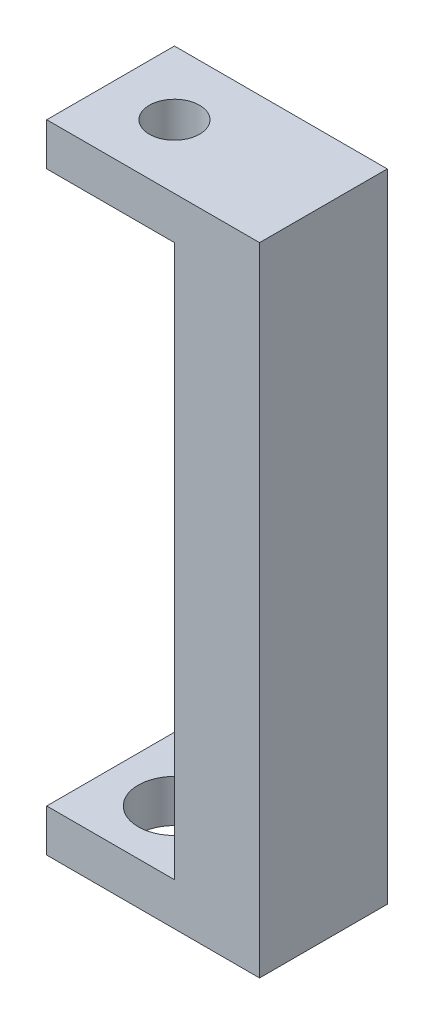
ISO-10303-21;
HEADER;
FILE_DESCRIPTION(('STEP AP214'),'2;1');
FILE_NAME('part.step','',(''),(''),'','','');
FILE_SCHEMA(('AUTOMOTIVE_DESIGN { 1 0 10303 214 1 1 1 1 }'));
ENDSEC;
DATA;
#1=APPLICATION_CONTEXT('core data for automotive mechanical design processes');
#2=APPLICATION_PROTOCOL_DEFINITION('international standard','automotive_design',2000,#1);
#3=PRODUCT_CONTEXT('',#1,'mechanical');
#4=PRODUCT('Part','Part','',(#3));
#5=PRODUCT_RELATED_PRODUCT_CATEGORY('part','',(#4));
#6=PRODUCT_DEFINITION_FORMATION('','',#4);
#7=PRODUCT_DEFINITION_CONTEXT('part definition',#1,'design');
#8=PRODUCT_DEFINITION('design','',#6,#7);
#9=PRODUCT_DEFINITION_SHAPE('','',#8);
#10=(LENGTH_UNIT() NAMED_UNIT(*) SI_UNIT(.MILLI.,.METRE.));
#11=(NAMED_UNIT(*) PLANE_ANGLE_UNIT() SI_UNIT($,.RADIAN.));
#12=(NAMED_UNIT(*) SI_UNIT($,.STERADIAN.) SOLID_ANGLE_UNIT());
#13=UNCERTAINTY_MEASURE_WITH_UNIT(LENGTH_MEASURE(1.E-05),#10,'distance_accuracy_value','');
#14=(GEOMETRIC_REPRESENTATION_CONTEXT(3) GLOBAL_UNCERTAINTY_ASSIGNED_CONTEXT((#13)) GLOBAL_UNIT_ASSIGNED_CONTEXT((#10,
#11,#12)) REPRESENTATION_CONTEXT('',''));
#15=CARTESIAN_POINT('',(0.,0.,0.));
#16=DIRECTION('',(0.,0.,1.));
#17=DIRECTION('',(1.,0.,0.));
#18=AXIS2_PLACEMENT_3D('',#15,#16,#17);
#19=CARTESIAN_POINT('',(-8.74763523506,18.4164001295598,7.62));
#20=DIRECTION('',(1.,0.,0.));
#21=DIRECTION('',(0.,0.,-1.));
#22=AXIS2_PLACEMENT_3D('',#19,#20,#21);
#23=PLANE('',#22);
#24=DIRECTION('',(0.,-1.,0.));
#25=VECTOR('',#24,1.);
#26=CARTESIAN_POINT('',(-8.74763523506,18.4164001295598,0.));
#27=LINE('',#26,#25);
#28=CARTESIAN_POINT('',(-8.74763523506,18.4164001295598,0.));
#29=VERTEX_POINT('',#28);
#30=CARTESIAN_POINT('',(-8.74763523506,15.8764001295598,0.));
#31=VERTEX_POINT('',#30);
#32=EDGE_CURVE('E128',#29,#31,#27,.T.);
#33=ORIENTED_EDGE('',*,*,#32,.T.);
#34=DIRECTION('',(0.,0.,-1.));
#35=VECTOR('',#34,1.);
#36=CARTESIAN_POINT('',(-8.74763523506,15.8764001295598,7.62));
#37=LINE('',#36,#35);
#38=CARTESIAN_POINT('',(-8.74763523506,15.8764001295598,7.62));
#39=VERTEX_POINT('',#38);
#40=EDGE_CURVE('E11',#39,#31,#37,.T.);
#41=ORIENTED_EDGE('',*,*,#40,.F.);
#42=DIRECTION('',(0.,-1.,0.));
#43=VECTOR('',#42,1.);
#44=CARTESIAN_POINT('',(-8.74763523506,18.4164001295598,7.62));
#45=LINE('',#44,#43);
#46=CARTESIAN_POINT('',(-8.74763523506,18.4164001295598,7.62));
#47=VERTEX_POINT('',#46);
#48=EDGE_CURVE('E143',#47,#39,#45,.T.);
#49=ORIENTED_EDGE('',*,*,#48,.F.);
#50=DIRECTION('',(0.,0.,-1.));
#51=VECTOR('',#50,1.);
#52=CARTESIAN_POINT('',(-8.74763523506,18.4164001295598,7.62));
#53=LINE('',#52,#51);
#54=EDGE_CURVE('E124',#47,#29,#53,.T.);
#55=ORIENTED_EDGE('',*,*,#54,.T.);
#56=EDGE_LOOP('',(#33,#41,#49,#55));
#57=FACE_BOUND('',#56,.T.);
#58=ADVANCED_FACE('F32',(#57),#23,.F.);
#59=CARTESIAN_POINT('',(-8.74763523506,15.8764001295598,7.62));
#60=DIRECTION('',(0.,1.,0.));
#61=DIRECTION('',(0.,0.,1.));
#62=AXIS2_PLACEMENT_3D('',#59,#60,#61);
#63=PLANE('',#62);
#64=CARTESIAN_POINT('',(-4.93763523506,15.8764001295598,3.81));
#65=DIRECTION('',(0.,-1.,0.));
#66=DIRECTION('',(0.,0.,-1.));
#67=AXIS2_PLACEMENT_3D('',#64,#65,#66);
#68=CIRCLE('',#67,1.5);
#69=CARTESIAN_POINT('',(-4.93763523506,15.8764001295598,2.31));
#70=VERTEX_POINT('',#69);
#71=EDGE_CURVE('E182',#70,#70,#68,.T.);
#72=ORIENTED_EDGE('',*,*,#71,.F.);
#73=EDGE_LOOP('',(#72));
#74=FACE_BOUND('',#73,.T.);
#75=DIRECTION('',(1.,0.,0.));
#76=VECTOR('',#75,1.);
#77=CARTESIAN_POINT('',(-8.74763523506,15.8764001295598,0.));
#78=LINE('',#77,#76);
#79=CARTESIAN_POINT('',(-1.12763523506,15.8764001295598,0.));
#80=VERTEX_POINT('',#79);
#81=EDGE_CURVE('E131',#31,#80,#78,.T.);
#82=ORIENTED_EDGE('',*,*,#81,.T.);
#83=DIRECTION('',(0.,0.,-1.));
#84=VECTOR('',#83,1.);
#85=CARTESIAN_POINT('',(-1.12763523506,15.8764001295598,7.62));
#86=LINE('',#85,#84);
#87=CARTESIAN_POINT('',(-1.12763523506,15.8764001295598,7.62));
#88=VERTEX_POINT('',#87);
#89=EDGE_CURVE('E40',#88,#80,#86,.T.);
#90=ORIENTED_EDGE('',*,*,#89,.F.);
#91=DIRECTION('',(1.,0.,0.));
#92=VECTOR('',#91,1.);
#93=CARTESIAN_POINT('',(-8.74763523506,15.8764001295598,7.62));
#94=LINE('',#93,#92);
#95=EDGE_CURVE('E91',#39,#88,#94,.T.);
#96=ORIENTED_EDGE('',*,*,#95,.F.);
#97=ORIENTED_EDGE('',*,*,#40,.T.);
#98=EDGE_LOOP('',(#82,#90,#96,#97));
#99=FACE_BOUND('',#98,.T.);
#100=ADVANCED_FACE('F197',(#74,#99),#63,.F.);
#101=CARTESIAN_POINT('',(-1.12763523506,15.8764001295598,7.62));
#102=DIRECTION('',(1.,0.,0.));
#103=DIRECTION('',(0.,1.,0.));
#104=AXIS2_PLACEMENT_3D('',#101,#102,#103);
#105=PLANE('',#104);
#106=DIRECTION('',(0.,-1.,0.));
#107=VECTOR('',#106,1.);
#108=CARTESIAN_POINT('',(-1.12763523506,15.8764001295598,0.));
#109=LINE('',#108,#107);
#110=CARTESIAN_POINT('',(-1.12763523506,-17.0435998704402,0.));
#111=VERTEX_POINT('',#110);
#112=EDGE_CURVE('E134',#80,#111,#109,.T.);
#113=ORIENTED_EDGE('',*,*,#112,.T.);
#114=DIRECTION('',(0.,0.,-1.));
#115=VECTOR('',#114,1.);
#116=CARTESIAN_POINT('',(-1.12763523506,-17.0435998704402,7.62));
#117=LINE('',#116,#115);
#118=CARTESIAN_POINT('',(-1.12763523506,-17.0435998704402,7.62));
#119=VERTEX_POINT('',#118);
#120=EDGE_CURVE('E150',#119,#111,#117,.T.);
#121=ORIENTED_EDGE('',*,*,#120,.F.);
#122=DIRECTION('',(0.,-1.,0.));
#123=VECTOR('',#122,1.);
#124=CARTESIAN_POINT('',(-1.12763523506,15.8764001295598,7.62));
#125=LINE('',#124,#123);
#126=EDGE_CURVE('E158',#88,#119,#125,.T.);
#127=ORIENTED_EDGE('',*,*,#126,.F.);
#128=ORIENTED_EDGE('',*,*,#89,.T.);
#129=EDGE_LOOP('',(#113,#121,#127,#128));
#130=FACE_BOUND('',#129,.T.);
#131=ADVANCED_FACE('F156',(#130),#105,.F.);
#132=CARTESIAN_POINT('',(-8.74763523506,-17.0435998704402,7.62));
#133=DIRECTION('',(0.,-1.,0.));
#134=DIRECTION('',(0.,0.,-1.));
#135=AXIS2_PLACEMENT_3D('',#132,#133,#134);
#136=PLANE('',#135);
#137=CARTESIAN_POINT('',(-4.93763523506,-17.0435998704402,3.81));
#138=DIRECTION('',(0.,1.,0.));
#139=DIRECTION('',(0.,0.,1.));
#140=AXIS2_PLACEMENT_3D('',#137,#138,#139);
#141=CIRCLE('',#140,2.159);
#142=CARTESIAN_POINT('',(-4.93763523506,-17.0435998704402,5.969));
#143=VERTEX_POINT('',#142);
#144=EDGE_CURVE('E176',#143,#143,#141,.T.);
#145=ORIENTED_EDGE('',*,*,#144,.F.);
#146=EDGE_LOOP('',(#145));
#147=FACE_BOUND('',#146,.T.);
#148=DIRECTION('',(-1.,0.,0.));
#149=VECTOR('',#148,1.);
#150=CARTESIAN_POINT('',(-8.74763523506,-17.0435998704402,0.));
#151=LINE('',#150,#149);
#152=CARTESIAN_POINT('',(-8.74763523506,-17.0435998704402,0.));
#153=VERTEX_POINT('',#152);
#154=EDGE_CURVE('E136',#111,#153,#151,.T.);
#155=ORIENTED_EDGE('',*,*,#154,.T.);
#156=DIRECTION('',(0.,0.,-1.));
#157=VECTOR('',#156,1.);
#158=CARTESIAN_POINT('',(-8.74763523506,-17.0435998704402,7.62));
#159=LINE('',#158,#157);
#160=CARTESIAN_POINT('',(-8.74763523506,-17.0435998704402,7.62));
#161=VERTEX_POINT('',#160);
#162=EDGE_CURVE('E147',#161,#153,#159,.T.);
#163=ORIENTED_EDGE('',*,*,#162,.F.);
#164=DIRECTION('',(-1.,0.,0.));
#165=VECTOR('',#164,1.);
#166=CARTESIAN_POINT('',(-8.74763523506,-17.0435998704402,7.62));
#167=LINE('',#166,#165);
#168=EDGE_CURVE('E170',#119,#161,#167,.T.);
#169=ORIENTED_EDGE('',*,*,#168,.F.);
#170=ORIENTED_EDGE('',*,*,#120,.T.);
#171=EDGE_LOOP('',(#155,#163,#169,#170));
#172=FACE_BOUND('',#171,.T.);
#173=ADVANCED_FACE('F166',(#147,#172),#136,.F.);
#174=CARTESIAN_POINT('',(-8.74763523506,-17.0435998704402,7.62));
#175=DIRECTION('',(1.,0.,0.));
#176=DIRECTION('',(0.,0.,-1.));
#177=AXIS2_PLACEMENT_3D('',#174,#175,#176);
#178=PLANE('',#177);
#179=DIRECTION('',(0.,-1.,0.));
#180=VECTOR('',#179,1.);
#181=CARTESIAN_POINT('',(-8.74763523506,-17.0435998704402,0.));
#182=LINE('',#181,#180);
#183=CARTESIAN_POINT('',(-8.74763523506,-19.5835998704402,0.));
#184=VERTEX_POINT('',#183);
#185=EDGE_CURVE('E138',#153,#184,#182,.T.);
#186=ORIENTED_EDGE('',*,*,#185,.T.);
#187=DIRECTION('',(0.,0.,-1.));
#188=VECTOR('',#187,1.);
#189=CARTESIAN_POINT('',(-8.74763523506,-19.5835998704402,7.62));
#190=LINE('',#189,#188);
#191=CARTESIAN_POINT('',(-8.74763523506,-19.5835998704402,7.62));
#192=VERTEX_POINT('',#191);
#193=EDGE_CURVE('E119',#192,#184,#190,.T.);
#194=ORIENTED_EDGE('',*,*,#193,.F.);
#195=DIRECTION('',(0.,-1.,0.));
#196=VECTOR('',#195,1.);
#197=CARTESIAN_POINT('',(-8.74763523506,-17.0435998704402,7.62));
#198=LINE('',#197,#196);
#199=EDGE_CURVE('E110',#161,#192,#198,.T.);
#200=ORIENTED_EDGE('',*,*,#199,.F.);
#201=ORIENTED_EDGE('',*,*,#162,.T.);
#202=EDGE_LOOP('',(#186,#194,#200,#201));
#203=FACE_BOUND('',#202,.T.);
#204=ADVANCED_FACE('F169',(#203),#178,.F.);
#205=CARTESIAN_POINT('',(-8.74763523506,-19.5835998704402,7.62));
#206=DIRECTION('',(0.,1.,0.));
#207=DIRECTION('',(0.,0.,1.));
#208=AXIS2_PLACEMENT_3D('',#205,#206,#207);
#209=PLANE('',#208);
#210=CARTESIAN_POINT('',(-4.93763523506,-19.5835998704402,3.81));
#211=DIRECTION('',(0.,1.,0.));
#212=DIRECTION('',(0.,0.,1.));
#213=AXIS2_PLACEMENT_3D('',#210,#211,#212);
#214=CIRCLE('',#213,2.159);
#215=CARTESIAN_POINT('',(-4.93763523506,-19.5835998704402,5.969));
#216=VERTEX_POINT('',#215);
#217=EDGE_CURVE('E132',#216,#216,#214,.T.);
#218=ORIENTED_EDGE('',*,*,#217,.T.);
#219=EDGE_LOOP('',(#218));
#220=FACE_BOUND('',#219,.T.);
#221=DIRECTION('',(1.,0.,0.));
#222=VECTOR('',#221,1.);
#223=CARTESIAN_POINT('',(-8.74763523506,-19.5835998704402,0.));
#224=LINE('',#223,#222);
#225=CARTESIAN_POINT('',(3.95236476494,-19.5835998704402,0.));
#226=VERTEX_POINT('',#225);
#227=EDGE_CURVE('E118',#184,#226,#224,.T.);
#228=ORIENTED_EDGE('',*,*,#227,.T.);
#229=DIRECTION('',(0.,0.,-1.));
#230=VECTOR('',#229,1.);
#231=CARTESIAN_POINT('',(3.95236476494,-19.5835998704402,7.62));
#232=LINE('',#231,#230);
#233=CARTESIAN_POINT('',(3.95236476494,-19.5835998704402,7.62));
#234=VERTEX_POINT('',#233);
#235=EDGE_CURVE('E115',#234,#226,#232,.T.);
#236=ORIENTED_EDGE('',*,*,#235,.F.);
#237=DIRECTION('',(1.,0.,0.));
#238=VECTOR('',#237,1.);
#239=CARTESIAN_POINT('',(-8.74763523506,-19.5835998704402,7.62));
#240=LINE('',#239,#238);
#241=EDGE_CURVE('E104',#192,#234,#240,.T.);
#242=ORIENTED_EDGE('',*,*,#241,.F.);
#243=ORIENTED_EDGE('',*,*,#193,.T.);
#244=EDGE_LOOP('',(#228,#236,#242,#243));
#245=FACE_BOUND('',#244,.T.);
#246=ADVANCED_FACE('F116',(#220,#245),#209,.F.);
#247=CARTESIAN_POINT('',(3.95236476494,18.4164001295598,7.62));
#248=DIRECTION('',(-1.,0.,0.));
#249=DIRECTION('',(0.,-1.,0.));
#250=AXIS2_PLACEMENT_3D('',#247,#248,#249);
#251=PLANE('',#250);
#252=DIRECTION('',(0.,1.,0.));
#253=VECTOR('',#252,1.);
#254=CARTESIAN_POINT('',(3.95236476494,18.4164001295598,0.));
#255=LINE('',#254,#253);
#256=CARTESIAN_POINT('',(3.95236476494,18.4164001295598,0.));
#257=VERTEX_POINT('',#256);
#258=EDGE_CURVE('E77',#226,#257,#255,.T.);
#259=ORIENTED_EDGE('',*,*,#258,.T.);
#260=DIRECTION('',(0.,0.,-1.));
#261=VECTOR('',#260,1.);
#262=CARTESIAN_POINT('',(3.95236476494,18.4164001295598,7.62));
#263=LINE('',#262,#261);
#264=CARTESIAN_POINT('',(3.95236476494,18.4164001295598,7.62));
#265=VERTEX_POINT('',#264);
#266=EDGE_CURVE('E120',#265,#257,#263,.T.);
#267=ORIENTED_EDGE('',*,*,#266,.F.);
#268=DIRECTION('',(0.,1.,0.));
#269=VECTOR('',#268,1.);
#270=CARTESIAN_POINT('',(3.95236476494,18.4164001295598,7.62));
#271=LINE('',#270,#269);
#272=EDGE_CURVE('E108',#234,#265,#271,.T.);
#273=ORIENTED_EDGE('',*,*,#272,.F.);
#274=ORIENTED_EDGE('',*,*,#235,.T.);
#275=EDGE_LOOP('',(#259,#267,#273,#274));
#276=FACE_BOUND('',#275,.T.);
#277=ADVANCED_FACE('F122',(#276),#251,.F.);
#278=CARTESIAN_POINT('',(-8.74763523506,18.4164001295598,7.62));
#279=DIRECTION('',(0.,-1.,0.));
#280=DIRECTION('',(0.,0.,-1.));
#281=AXIS2_PLACEMENT_3D('',#278,#279,#280);
#282=PLANE('',#281);
#283=CARTESIAN_POINT('',(-4.93763523506,18.4164001295598,3.81));
#284=DIRECTION('',(0.,-1.,0.));
#285=DIRECTION('',(0.,0.,-1.));
#286=AXIS2_PLACEMENT_3D('',#283,#284,#285);
#287=CIRCLE('',#286,1.5);
#288=CARTESIAN_POINT('',(-4.93763523506,18.4164001295598,2.31));
#289=VERTEX_POINT('',#288);
#290=EDGE_CURVE('E179',#289,#289,#287,.T.);
#291=ORIENTED_EDGE('',*,*,#290,.T.);
#292=EDGE_LOOP('',(#291));
#293=FACE_BOUND('',#292,.T.);
#294=DIRECTION('',(-1.,0.,0.));
#295=VECTOR('',#294,1.);
#296=CARTESIAN_POINT('',(-8.74763523506,18.4164001295598,0.));
#297=LINE('',#296,#295);
#298=EDGE_CURVE('E83',#257,#29,#297,.T.);
#299=ORIENTED_EDGE('',*,*,#298,.T.);
#300=ORIENTED_EDGE('',*,*,#54,.F.);
#301=DIRECTION('',(-1.,0.,0.));
#302=VECTOR('',#301,1.);
#303=CARTESIAN_POINT('',(-8.74763523506,18.4164001295598,7.62));
#304=LINE('',#303,#302);
#305=EDGE_CURVE('E48',#265,#47,#304,.T.);
#306=ORIENTED_EDGE('',*,*,#305,.F.);
#307=ORIENTED_EDGE('',*,*,#266,.T.);
#308=EDGE_LOOP('',(#299,#300,#306,#307));
#309=FACE_BOUND('',#308,.T.);
#310=ADVANCED_FACE('F188',(#293,#309),#282,.F.);
#311=CARTESIAN_POINT('',(0.,0.,7.62));
#312=DIRECTION('',(0.,0.,1.));
#313=DIRECTION('',(1.,0.,0.));
#314=AXIS2_PLACEMENT_3D('',#311,#312,#313);
#315=PLANE('',#314);
#316=ORIENTED_EDGE('',*,*,#48,.T.);
#317=ORIENTED_EDGE('',*,*,#95,.T.);
#318=ORIENTED_EDGE('',*,*,#126,.T.);
#319=ORIENTED_EDGE('',*,*,#168,.T.);
#320=ORIENTED_EDGE('',*,*,#199,.T.);
#321=ORIENTED_EDGE('',*,*,#241,.T.);
#322=ORIENTED_EDGE('',*,*,#272,.T.);
#323=ORIENTED_EDGE('',*,*,#305,.T.);
#324=EDGE_LOOP('',(#316,#317,#318,#319,#320,#321,#322,#323));
#325=FACE_BOUND('',#324,.T.);
#326=ADVANCED_FACE('F106',(#325),#315,.T.);
#327=CARTESIAN_POINT('',(0.,0.,0.));
#328=DIRECTION('',(0.,0.,1.));
#329=DIRECTION('',(1.,0.,0.));
#330=AXIS2_PLACEMENT_3D('',#327,#328,#329);
#331=PLANE('',#330);
#332=ORIENTED_EDGE('',*,*,#32,.F.);
#333=ORIENTED_EDGE('',*,*,#298,.F.);
#334=ORIENTED_EDGE('',*,*,#258,.F.);
#335=ORIENTED_EDGE('',*,*,#227,.F.);
#336=ORIENTED_EDGE('',*,*,#185,.F.);
#337=ORIENTED_EDGE('',*,*,#154,.F.);
#338=ORIENTED_EDGE('',*,*,#112,.F.);
#339=ORIENTED_EDGE('',*,*,#81,.F.);
#340=EDGE_LOOP('',(#332,#333,#334,#335,#336,#337,#338,#339));
#341=FACE_BOUND('',#340,.T.);
#342=ADVANCED_FACE('F162',(#341),#331,.F.);
#343=CARTESIAN_POINT('',(-4.93763523506,-19.5835998704402,3.81));
#344=DIRECTION('',(0.,1.,0.));
#345=DIRECTION('',(0.,0.,1.));
#346=AXIS2_PLACEMENT_3D('',#343,#344,#345);
#347=CYLINDRICAL_SURFACE('',#346,2.159);
#348=ORIENTED_EDGE('',*,*,#217,.F.);
#349=EDGE_LOOP('',(#348));
#350=FACE_BOUND('',#349,.T.);
#351=ORIENTED_EDGE('',*,*,#144,.T.);
#352=EDGE_LOOP('',(#351));
#353=FACE_BOUND('',#352,.T.);
#354=ADVANCED_FACE('F193',(#350,#353),#347,.F.);
#355=CARTESIAN_POINT('',(-4.93763523506,18.4164001295598,3.81));
#356=DIRECTION('',(0.,-1.,0.));
#357=DIRECTION('',(0.,0.,-1.));
#358=AXIS2_PLACEMENT_3D('',#355,#356,#357);
#359=CYLINDRICAL_SURFACE('',#358,1.5);
#360=ORIENTED_EDGE('',*,*,#290,.F.);
#361=EDGE_LOOP('',(#360));
#362=FACE_BOUND('',#361,.T.);
#363=ORIENTED_EDGE('',*,*,#71,.T.);
#364=EDGE_LOOP('',(#363));
#365=FACE_BOUND('',#364,.T.);
#366=ADVANCED_FACE('F190',(#362,#365),#359,.F.);
#367=CLOSED_SHELL('',(#58,#100,#131,#173,#204,#246,#277,#310,#326,#342,#354,#366));
#368=MANIFOLD_SOLID_BREP('B2',#367);
#369=ADVANCED_BREP_SHAPE_REPRESENTATION('',(#18,#368),#14);
#370=SHAPE_DEFINITION_REPRESENTATION(#9,#369);
ENDSEC;
END-ISO-10303-21;
